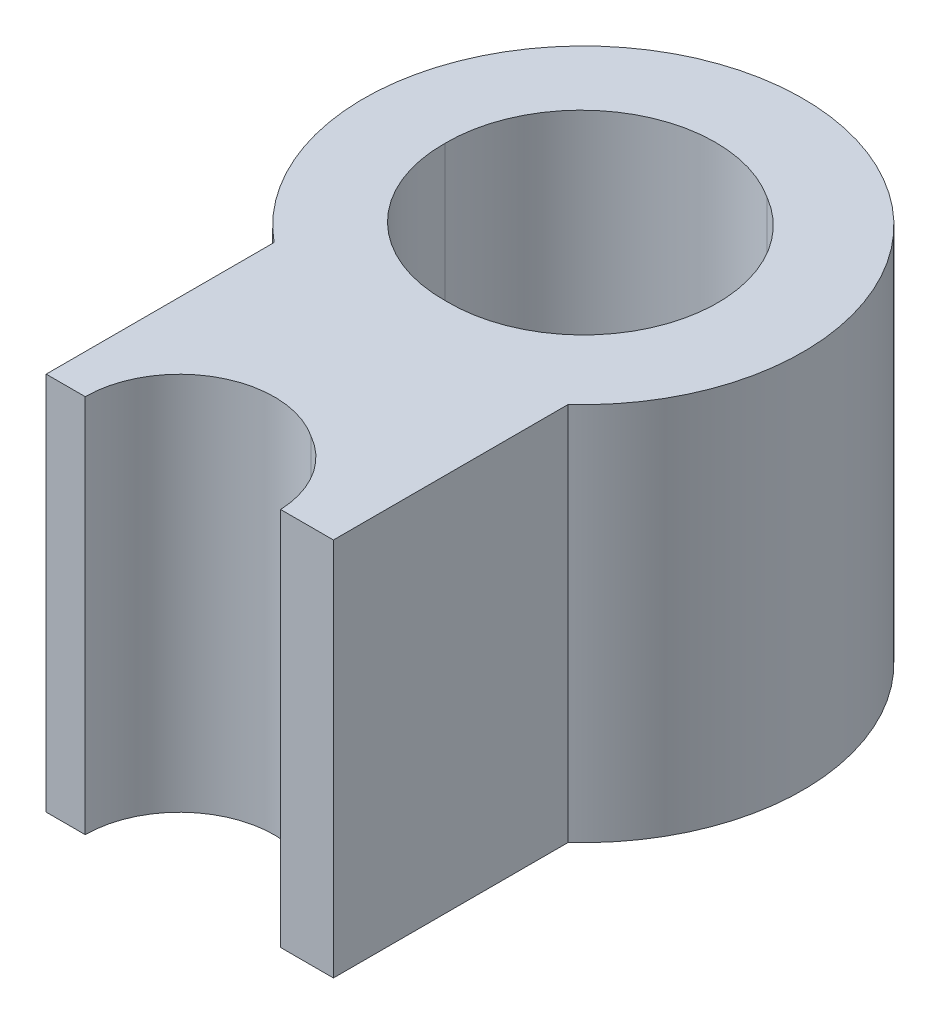
ISO-10303-21;
HEADER;
FILE_DESCRIPTION(('STEP AP214'),'2;1');
FILE_NAME('part.step','',(''),(''),'','','');
FILE_SCHEMA(('AUTOMOTIVE_DESIGN { 1 0 10303 214 1 1 1 1 }'));
ENDSEC;
DATA;
#1=APPLICATION_CONTEXT('core data for automotive mechanical design processes');
#2=APPLICATION_PROTOCOL_DEFINITION('international standard','automotive_design',2000,#1);
#3=PRODUCT_CONTEXT('',#1,'mechanical');
#4=PRODUCT('Part','Part','',(#3));
#5=PRODUCT_RELATED_PRODUCT_CATEGORY('part','',(#4));
#6=PRODUCT_DEFINITION_FORMATION('','',#4);
#7=PRODUCT_DEFINITION_CONTEXT('part definition',#1,'design');
#8=PRODUCT_DEFINITION('design','',#6,#7);
#9=PRODUCT_DEFINITION_SHAPE('','',#8);
#10=(LENGTH_UNIT() NAMED_UNIT(*) SI_UNIT(.MILLI.,.METRE.));
#11=(NAMED_UNIT(*) PLANE_ANGLE_UNIT() SI_UNIT($,.RADIAN.));
#12=(NAMED_UNIT(*) SI_UNIT($,.STERADIAN.) SOLID_ANGLE_UNIT());
#13=UNCERTAINTY_MEASURE_WITH_UNIT(LENGTH_MEASURE(1.E-05),#10,'distance_accuracy_value','');
#14=(GEOMETRIC_REPRESENTATION_CONTEXT(3) GLOBAL_UNCERTAINTY_ASSIGNED_CONTEXT((#13)) GLOBAL_UNIT_ASSIGNED_CONTEXT((#10,
#11,#12)) REPRESENTATION_CONTEXT('',''));
#15=CARTESIAN_POINT('',(0.,0.,0.));
#16=DIRECTION('',(0.,0.,1.));
#17=DIRECTION('',(1.,0.,0.));
#18=AXIS2_PLACEMENT_3D('',#15,#16,#17);
#19=CARTESIAN_POINT('',(1.26536763995187,2.87183105039429,15.59112871048));
#20=DIRECTION('',(0.,1.,0.));
#21=DIRECTION('',(0.,0.,-1.));
#22=AXIS2_PLACEMENT_3D('',#19,#20,#21);
#23=PLANE('',#22);
#24=CARTESIAN_POINT('',(3.71646763995182,2.87183105039429,23.2098996244558));
#25=DIRECTION('',(0.,1.,0.));
#26=DIRECTION('',(0.,0.,-1.));
#27=AXIS2_PLACEMENT_3D('',#24,#25,#26);
#28=CIRCLE('',#27,0.425);
#29=CARTESIAN_POINT('',(3.29150634226328,2.87183105039429,23.204164167466));
#30=VERTEX_POINT('',#29);
#31=CARTESIAN_POINT('',(3.72570075471357,2.87183105039429,23.6347993180211));
#32=VERTEX_POINT('',#31);
#33=EDGE_CURVE('E141',#30,#32,#28,.T.);
#34=ORIENTED_EDGE('',*,*,#33,.F.);
#35=CARTESIAN_POINT('',(3.71646763995187,2.87183105039429,23.1984287104753));
#36=DIRECTION('',(0.,1.,0.));
#37=DIRECTION('',(0.,0.,1.));
#38=AXIS2_PLACEMENT_3D('',#35,#36,#37);
#39=CIRCLE('',#38,0.425);
#40=CARTESIAN_POINT('',(3.94988526091918,2.87183105039429,22.8432650661901));
#41=VERTEX_POINT('',#40);
#42=EDGE_CURVE('E156',#41,#30,#39,.T.);
#43=ORIENTED_EDGE('',*,*,#42,.F.);
#44=CARTESIAN_POINT('',(3.73493386947132,2.87183105039429,23.2098996244558));
#45=DIRECTION('',(0.,1.,0.));
#46=DIRECTION('',(0.,0.,-1.));
#47=AXIS2_PLACEMENT_3D('',#44,#45,#46);
#48=CIRCLE('',#47,0.425);
#49=EDGE_CURVE('E224',#32,#41,#48,.T.);
#50=ORIENTED_EDGE('',*,*,#49,.F.);
#51=EDGE_LOOP('',(#34,#43,#50));
#52=FACE_BOUND('',#51,.T.);
#53=CARTESIAN_POINT('',(3.73493386947133,2.87183105039429,24.4798996244558));
#54=DIRECTION('',(0.,1.,0.));
#55=DIRECTION('',(0.999103542626486,0.,-0.0423333333344553));
#56=AXIS2_PLACEMENT_3D('',#53,#54,#55);
#57=CIRCLE('',#56,0.299999999999992);
#58=CARTESIAN_POINT('',(4.03466493225927,2.87183105039429,24.4671996244555));
#59=VERTEX_POINT('',#58);
#60=CARTESIAN_POINT('',(3.88389648477401,2.87183105039429,24.2194958240953));
#61=VERTEX_POINT('',#60);
#62=EDGE_CURVE('E159',#59,#61,#57,.T.);
#63=ORIENTED_EDGE('',*,*,#62,.F.);
#64=DIRECTION('',(-1.,0.,-1.06337566312106E-12));
#65=VECTOR('',#64,1.);
#66=CARTESIAN_POINT('',(4.20174867335395,2.87183105039429,24.4671996244556));
#67=LINE('',#66,#65);
#68=CARTESIAN_POINT('',(4.20174867335395,2.87183105039429,24.4671996244556));
#69=VERTEX_POINT('',#68);
#70=EDGE_CURVE('E170',#69,#59,#67,.T.);
#71=ORIENTED_EDGE('',*,*,#70,.F.);
#72=DIRECTION('',(5.02522919053297E-13,0.,-1.));
#73=VECTOR('',#72,1.);
#74=CARTESIAN_POINT('',(4.20174867335395,2.87183105039429,24.4671996244556));
#75=LINE('',#74,#73);
#76=CARTESIAN_POINT('',(4.20174867335433,2.87183105039429,23.7245472516448));
#77=VERTEX_POINT('',#76);
#78=EDGE_CURVE('E26',#69,#77,#75,.T.);
#79=ORIENTED_EDGE('',*,*,#78,.T.);
#80=CARTESIAN_POINT('',(3.73493386947132,2.87183105039429,23.2098996244558));
#81=DIRECTION('',(0.,1.,0.));
#82=DIRECTION('',(0.,0.,-1.));
#83=AXIS2_PLACEMENT_3D('',#80,#81,#82);
#84=CIRCLE('',#83,0.694822453073876);
#85=CARTESIAN_POINT('',(3.29305478059185,2.87183105039429,23.7461095759735));
#86=VERTEX_POINT('',#85);
#87=EDGE_CURVE('E11',#77,#86,#84,.T.);
#88=ORIENTED_EDGE('',*,*,#87,.T.);
#89=DIRECTION('',(-5.6636748734305E-13,0.,-1.));
#90=VECTOR('',#89,1.);
#91=CARTESIAN_POINT('',(3.29305478059225,2.87183105039429,24.467199624456));
#92=LINE('',#91,#90);
#93=CARTESIAN_POINT('',(3.29305478059225,2.87183105039429,24.467199624456));
#94=VERTEX_POINT('',#93);
#95=EDGE_CURVE('E120',#94,#86,#92,.T.);
#96=ORIENTED_EDGE('',*,*,#95,.F.);
#97=DIRECTION('',(1.,0.,-1.62432664225037E-12));
#98=VECTOR('',#97,1.);
#99=CARTESIAN_POINT('',(3.29305478059225,2.87183105039429,24.467199624456));
#100=LINE('',#99,#98);
#101=CARTESIAN_POINT('',(3.41647015771654,2.87183105039429,24.4671996244558));
#102=VERTEX_POINT('',#101);
#103=EDGE_CURVE('E149',#94,#102,#100,.T.);
#104=ORIENTED_EDGE('',*,*,#103,.T.);
#105=CARTESIAN_POINT('',(3.71646763995189,2.87183105039429,24.4684287104753));
#106=DIRECTION('',(0.,1.,0.));
#107=DIRECTION('',(0.999103542626609,0.,0.0423333333315546));
#108=AXIS2_PLACEMENT_3D('',#105,#106,#107);
#109=CIRCLE('',#108,0.299999999999991);
#110=EDGE_CURVE('E155',#61,#102,#109,.T.);
#111=ORIENTED_EDGE('',*,*,#110,.F.);
#112=EDGE_LOOP('',(#63,#71,#79,#88,#96,#104,#111));
#113=FACE_BOUND('',#112,.T.);
#114=ADVANCED_FACE('F17',(#52,#113),#23,.T.);
#115=CARTESIAN_POINT('',(3.73493386947132,2.87183105039429,23.2098996244558));
#116=DIRECTION('',(0.,-1.,0.));
#117=DIRECTION('',(0.,0.,-1.));
#118=AXIS2_PLACEMENT_3D('',#115,#116,#117);
#119=CYLINDRICAL_SURFACE('',#118,0.694822453073876);
#120=CARTESIAN_POINT('',(3.73493386947132,1.6718310055699,23.2098996244558));
#121=DIRECTION('',(0.,1.,0.));
#122=DIRECTION('',(0.,0.,-1.));
#123=AXIS2_PLACEMENT_3D('',#120,#121,#122);
#124=CIRCLE('',#123,0.694822453073876);
#125=CARTESIAN_POINT('',(4.20174867335434,1.6718310055699,23.7245472516448));
#126=VERTEX_POINT('',#125);
#127=CARTESIAN_POINT('',(3.29305478059185,1.6718310055699,23.7461095759735));
#128=VERTEX_POINT('',#127);
#129=EDGE_CURVE('E126',#126,#128,#124,.T.);
#130=ORIENTED_EDGE('',*,*,#129,.T.);
#131=DIRECTION('',(0.,-1.,0.));
#132=VECTOR('',#131,1.);
#133=CARTESIAN_POINT('',(3.29305478059185,2.87183105039429,23.7461095759735));
#134=LINE('',#133,#132);
#135=EDGE_CURVE('E123',#86,#128,#134,.T.);
#136=ORIENTED_EDGE('',*,*,#135,.F.);
#137=ORIENTED_EDGE('',*,*,#87,.F.);
#138=DIRECTION('',(0.,-1.,0.));
#139=VECTOR('',#138,1.);
#140=CARTESIAN_POINT('',(4.20174867335433,2.87183105039429,23.7245472516448));
#141=LINE('',#140,#139);
#142=EDGE_CURVE('E167',#77,#126,#141,.T.);
#143=ORIENTED_EDGE('',*,*,#142,.T.);
#144=EDGE_LOOP('',(#130,#136,#137,#143));
#145=FACE_BOUND('',#144,.T.);
#146=ADVANCED_FACE('F124',(#145),#119,.T.);
#147=CARTESIAN_POINT('',(4.20174867335433,2.87183105039429,23.7245472516448));
#148=DIRECTION('',(1.,0.,5.02522919053297E-13));
#149=DIRECTION('',(-5.02522919053297E-13,0.,1.));
#150=AXIS2_PLACEMENT_3D('',#147,#148,#149);
#151=PLANE('',#150);
#152=DIRECTION('',(5.02522919053297E-13,0.,-1.));
#153=VECTOR('',#152,1.);
#154=CARTESIAN_POINT('',(4.20174867335637,1.6718310055699,19.6578379810631));
#155=LINE('',#154,#153);
#156=CARTESIAN_POINT('',(4.20174867335396,1.6718310055699,24.4671996244556));
#157=VERTEX_POINT('',#156);
#158=EDGE_CURVE('E260',#157,#126,#155,.T.);
#159=ORIENTED_EDGE('',*,*,#158,.T.);
#160=ORIENTED_EDGE('',*,*,#142,.F.);
#161=ORIENTED_EDGE('',*,*,#78,.F.);
#162=DIRECTION('',(0.,-1.,0.));
#163=VECTOR('',#162,1.);
#164=CARTESIAN_POINT('',(4.20174867335395,2.87183105039429,24.4671996244556));
#165=LINE('',#164,#163);
#166=EDGE_CURVE('E144',#69,#157,#165,.T.);
#167=ORIENTED_EDGE('',*,*,#166,.T.);
#168=EDGE_LOOP('',(#159,#160,#161,#167));
#169=FACE_BOUND('',#168,.T.);
#170=ADVANCED_FACE('F19',(#169),#151,.T.);
#171=CARTESIAN_POINT('',(4.20174867335395,2.87183105039429,24.4671996244556));
#172=DIRECTION('',(-1.06337566312106E-12,0.,1.));
#173=DIRECTION('',(1.,0.,1.06337566312106E-12));
#174=AXIS2_PLACEMENT_3D('',#171,#172,#173);
#175=PLANE('',#174);
#176=DIRECTION('',(1.,0.,1.06337566312106E-12));
#177=VECTOR('',#176,1.);
#178=CARTESIAN_POINT('',(2.7335581566482,1.6718310055699,24.4671996244541));
#179=LINE('',#178,#177);
#180=CARTESIAN_POINT('',(4.03466493225928,1.6718310055699,24.4671996244555));
#181=VERTEX_POINT('',#180);
#182=EDGE_CURVE('E255',#181,#157,#179,.T.);
#183=ORIENTED_EDGE('',*,*,#182,.T.);
#184=ORIENTED_EDGE('',*,*,#166,.F.);
#185=ORIENTED_EDGE('',*,*,#70,.T.);
#186=DIRECTION('',(0.,-1.,0.));
#187=VECTOR('',#186,1.);
#188=CARTESIAN_POINT('',(4.03466493225927,2.87183105039429,24.4671996244555));
#189=LINE('',#188,#187);
#190=EDGE_CURVE('E162',#59,#181,#189,.T.);
#191=ORIENTED_EDGE('',*,*,#190,.T.);
#192=EDGE_LOOP('',(#183,#184,#185,#191));
#193=FACE_BOUND('',#192,.T.);
#194=ADVANCED_FACE('F335',(#193),#175,.T.);
#195=CARTESIAN_POINT('',(3.71646763995187,2.87183105039429,23.1984287104753));
#196=DIRECTION('',(0.,-1.,0.));
#197=DIRECTION('',(-0.480681669070876,0.,-0.876895166493257));
#198=AXIS2_PLACEMENT_3D('',#195,#196,#197);
#199=CYLINDRICAL_SURFACE('',#198,0.425);
#200=CARTESIAN_POINT('',(3.71646763995187,1.6718310055699,23.1984287104753));
#201=DIRECTION('',(0.,-1.,0.));
#202=DIRECTION('',(0.,0.,1.));
#203=AXIS2_PLACEMENT_3D('',#200,#201,#202);
#204=CIRCLE('',#203,0.425);
#205=CARTESIAN_POINT('',(3.29150634226329,1.6718310055699,23.204164167466));
#206=VERTEX_POINT('',#205);
#207=CARTESIAN_POINT('',(3.94988526091919,1.6718310055699,22.8432650661901));
#208=VERTEX_POINT('',#207);
#209=EDGE_CURVE('E239',#206,#208,#204,.T.);
#210=ORIENTED_EDGE('',*,*,#209,.T.);
#211=DIRECTION('',(0.,-1.,0.));
#212=VECTOR('',#211,1.);
#213=CARTESIAN_POINT('',(3.94988526091918,2.87183105039429,22.8432650661901));
#214=LINE('',#213,#212);
#215=EDGE_CURVE('E229',#41,#208,#214,.T.);
#216=ORIENTED_EDGE('',*,*,#215,.F.);
#217=ORIENTED_EDGE('',*,*,#42,.T.);
#218=DIRECTION('',(0.,-1.,0.));
#219=VECTOR('',#218,1.);
#220=CARTESIAN_POINT('',(3.29150634226328,2.87183105039429,23.204164167466));
#221=LINE('',#220,#219);
#222=EDGE_CURVE('E221',#30,#206,#221,.T.);
#223=ORIENTED_EDGE('',*,*,#222,.T.);
#224=EDGE_LOOP('',(#210,#216,#217,#223));
#225=FACE_BOUND('',#224,.T.);
#226=ADVANCED_FACE('F337',(#225),#199,.F.);
#227=CARTESIAN_POINT('',(3.73493386947133,2.87183105039429,24.4798996244558));
#228=DIRECTION('',(0.,-1.,0.));
#229=DIRECTION('',(0.999103542626486,0.,-0.0423333333344553));
#230=AXIS2_PLACEMENT_3D('',#227,#228,#229);
#231=CYLINDRICAL_SURFACE('',#230,0.299999999999992);
#232=CARTESIAN_POINT('',(3.73493386947133,1.6718310055699,24.4798996244558));
#233=DIRECTION('',(0.,-1.,0.));
#234=DIRECTION('',(0.999103542626486,0.,-0.0423333333344553));
#235=AXIS2_PLACEMENT_3D('',#232,#233,#234);
#236=CIRCLE('',#235,0.299999999999992);
#237=CARTESIAN_POINT('',(3.88389648477402,1.6718310055699,24.2194958240953));
#238=VERTEX_POINT('',#237);
#239=EDGE_CURVE('E300',#238,#181,#236,.T.);
#240=ORIENTED_EDGE('',*,*,#239,.T.);
#241=ORIENTED_EDGE('',*,*,#190,.F.);
#242=ORIENTED_EDGE('',*,*,#62,.T.);
#243=DIRECTION('',(0.,-1.,0.));
#244=VECTOR('',#243,1.);
#245=CARTESIAN_POINT('',(3.88389648477401,2.87183105039429,24.2194958240953));
#246=LINE('',#245,#244);
#247=EDGE_CURVE('E152',#61,#238,#246,.T.);
#248=ORIENTED_EDGE('',*,*,#247,.T.);
#249=EDGE_LOOP('',(#240,#241,#242,#248));
#250=FACE_BOUND('',#249,.T.);
#251=ADVANCED_FACE('F333',(#250),#231,.F.);
#252=CARTESIAN_POINT('',(3.71646763995189,2.87183105039429,24.4684287104753));
#253=DIRECTION('',(0.,-1.,0.));
#254=DIRECTION('',(-0.468246185066809,0.,-0.883598047853423));
#255=AXIS2_PLACEMENT_3D('',#252,#253,#254);
#256=CYLINDRICAL_SURFACE('',#255,0.299999999999991);
#257=CARTESIAN_POINT('',(3.71646763995189,1.6718310055699,24.4684287104753));
#258=DIRECTION('',(0.,-1.,0.));
#259=DIRECTION('',(0.999103542626609,0.,0.0423333333315546));
#260=AXIS2_PLACEMENT_3D('',#257,#258,#259);
#261=CIRCLE('',#260,0.299999999999991);
#262=CARTESIAN_POINT('',(3.41647015771655,1.6718310055699,24.4671996244558));
#263=VERTEX_POINT('',#262);
#264=EDGE_CURVE('E293',#263,#238,#261,.T.);
#265=ORIENTED_EDGE('',*,*,#264,.T.);
#266=ORIENTED_EDGE('',*,*,#247,.F.);
#267=ORIENTED_EDGE('',*,*,#110,.T.);
#268=DIRECTION('',(0.,-1.,0.));
#269=VECTOR('',#268,1.);
#270=CARTESIAN_POINT('',(3.41647015771654,2.87183105039429,24.4671996244558));
#271=LINE('',#270,#269);
#272=EDGE_CURVE('E131',#102,#263,#271,.T.);
#273=ORIENTED_EDGE('',*,*,#272,.T.);
#274=EDGE_LOOP('',(#265,#266,#267,#273));
#275=FACE_BOUND('',#274,.T.);
#276=ADVANCED_FACE('F331',(#275),#256,.F.);
#277=CARTESIAN_POINT('',(3.41647015771654,2.87183105039429,24.4671996244558));
#278=DIRECTION('',(1.62432664225037E-12,0.,1.));
#279=DIRECTION('',(1.,0.,-1.62432664225037E-12));
#280=AXIS2_PLACEMENT_3D('',#277,#278,#279);
#281=PLANE('',#280);
#282=DIRECTION('',(1.,0.,-1.62432664225037E-12));
#283=VECTOR('',#282,1.);
#284=CARTESIAN_POINT('',(2.34091889884142,1.6718310055699,24.4671996244576));
#285=LINE('',#284,#283);
#286=CARTESIAN_POINT('',(3.29305478059226,1.6718310055699,24.467199624456));
#287=VERTEX_POINT('',#286);
#288=EDGE_CURVE('E282',#287,#263,#285,.T.);
#289=ORIENTED_EDGE('',*,*,#288,.T.);
#290=ORIENTED_EDGE('',*,*,#272,.F.);
#291=ORIENTED_EDGE('',*,*,#103,.F.);
#292=DIRECTION('',(0.,-1.,0.));
#293=VECTOR('',#292,1.);
#294=CARTESIAN_POINT('',(3.29305478059225,2.87183105039429,24.467199624456));
#295=LINE('',#294,#293);
#296=EDGE_CURVE('E134',#94,#287,#295,.T.);
#297=ORIENTED_EDGE('',*,*,#296,.T.);
#298=EDGE_LOOP('',(#289,#290,#291,#297));
#299=FACE_BOUND('',#298,.T.);
#300=ADVANCED_FACE('F326',(#299),#281,.T.);
#301=CARTESIAN_POINT('',(3.29305478059225,2.87183105039429,24.467199624456));
#302=DIRECTION('',(-1.,0.,5.6636748734305E-13));
#303=DIRECTION('',(0.,1.,0.));
#304=AXIS2_PLACEMENT_3D('',#301,#302,#303);
#305=PLANE('',#304);
#306=DIRECTION('',(5.6636748734305E-13,0.,1.));
#307=VECTOR('',#306,1.);
#308=CARTESIAN_POINT('',(3.29305478058974,1.6718310055699,20.0291641674674));
#309=LINE('',#308,#307);
#310=EDGE_CURVE('E267',#128,#287,#309,.T.);
#311=ORIENTED_EDGE('',*,*,#310,.T.);
#312=ORIENTED_EDGE('',*,*,#296,.F.);
#313=ORIENTED_EDGE('',*,*,#95,.T.);
#314=ORIENTED_EDGE('',*,*,#135,.T.);
#315=EDGE_LOOP('',(#311,#312,#313,#314));
#316=FACE_BOUND('',#315,.T.);
#317=ADVANCED_FACE('F133',(#316),#305,.T.);
#318=CARTESIAN_POINT('',(3.71646763995182,2.87183105039429,23.2098996244558));
#319=DIRECTION('',(0.,-1.,0.));
#320=DIRECTION('',(-0.704190673861214,0.,0.710010911780156));
#321=AXIS2_PLACEMENT_3D('',#318,#319,#320);
#322=CYLINDRICAL_SURFACE('',#321,0.425);
#323=CARTESIAN_POINT('',(3.71646763995182,1.6718310055699,23.2098996244558));
#324=DIRECTION('',(0.,-1.,0.));
#325=DIRECTION('',(0.,0.,-1.));
#326=AXIS2_PLACEMENT_3D('',#323,#324,#325);
#327=CIRCLE('',#326,0.425);
#328=CARTESIAN_POINT('',(3.72570075471357,1.6718310055699,23.6347993180211));
#329=VERTEX_POINT('',#328);
#330=EDGE_CURVE('E251',#329,#206,#327,.T.);
#331=ORIENTED_EDGE('',*,*,#330,.T.);
#332=ORIENTED_EDGE('',*,*,#222,.F.);
#333=ORIENTED_EDGE('',*,*,#33,.T.);
#334=DIRECTION('',(0.,-1.,0.));
#335=VECTOR('',#334,1.);
#336=CARTESIAN_POINT('',(3.72570075471357,2.87183105039429,23.6347993180211));
#337=LINE('',#336,#335);
#338=EDGE_CURVE('E230',#32,#329,#337,.T.);
#339=ORIENTED_EDGE('',*,*,#338,.T.);
#340=EDGE_LOOP('',(#331,#332,#333,#339));
#341=FACE_BOUND('',#340,.T.);
#342=ADVANCED_FACE('F369',(#341),#322,.F.);
#343=CARTESIAN_POINT('',(3.73493386947132,2.87183105039429,23.2098996244558));
#344=DIRECTION('',(0.,-1.,0.));
#345=DIRECTION('',(0.962153352800731,0.,0.27250857912057));
#346=AXIS2_PLACEMENT_3D('',#343,#344,#345);
#347=CYLINDRICAL_SURFACE('',#346,0.425);
#348=CARTESIAN_POINT('',(3.73493386947132,1.6718310055699,23.2098996244558));
#349=DIRECTION('',(0.,-1.,0.));
#350=DIRECTION('',(0.,0.,-1.));
#351=AXIS2_PLACEMENT_3D('',#348,#349,#350);
#352=CIRCLE('',#351,0.425);
#353=EDGE_CURVE('E244',#208,#329,#352,.T.);
#354=ORIENTED_EDGE('',*,*,#353,.T.);
#355=ORIENTED_EDGE('',*,*,#338,.F.);
#356=ORIENTED_EDGE('',*,*,#49,.T.);
#357=ORIENTED_EDGE('',*,*,#215,.T.);
#358=EDGE_LOOP('',(#354,#355,#356,#357));
#359=FACE_BOUND('',#358,.T.);
#360=ADVANCED_FACE('F367',(#359),#347,.F.);
#361=CARTESIAN_POINT('',(1.26536763995188,1.6718310055699,15.59112871048));
#362=DIRECTION('',(0.,1.,0.));
#363=DIRECTION('',(0.,0.,-1.));
#364=AXIS2_PLACEMENT_3D('',#361,#362,#363);
#365=PLANE('',#364);
#366=ORIENTED_EDGE('',*,*,#330,.F.);
#367=ORIENTED_EDGE('',*,*,#353,.F.);
#368=ORIENTED_EDGE('',*,*,#209,.F.);
#369=EDGE_LOOP('',(#366,#367,#368));
#370=FACE_BOUND('',#369,.T.);
#371=ORIENTED_EDGE('',*,*,#239,.F.);
#372=ORIENTED_EDGE('',*,*,#264,.F.);
#373=ORIENTED_EDGE('',*,*,#288,.F.);
#374=ORIENTED_EDGE('',*,*,#310,.F.);
#375=ORIENTED_EDGE('',*,*,#129,.F.);
#376=ORIENTED_EDGE('',*,*,#158,.F.);
#377=ORIENTED_EDGE('',*,*,#182,.F.);
#378=EDGE_LOOP('',(#371,#372,#373,#374,#375,#376,#377));
#379=FACE_BOUND('',#378,.T.);
#380=ADVANCED_FACE('F321',(#370,#379),#365,.F.);
#381=CLOSED_SHELL('',(#114,#146,#170,#194,#226,#251,#276,#300,#317,#342,#360,#380));
#382=MANIFOLD_SOLID_BREP('B1',#381);
#383=ADVANCED_BREP_SHAPE_REPRESENTATION('',(#18,#382),#14);
#384=SHAPE_DEFINITION_REPRESENTATION(#9,#383);
ENDSEC;
END-ISO-10303-21;
